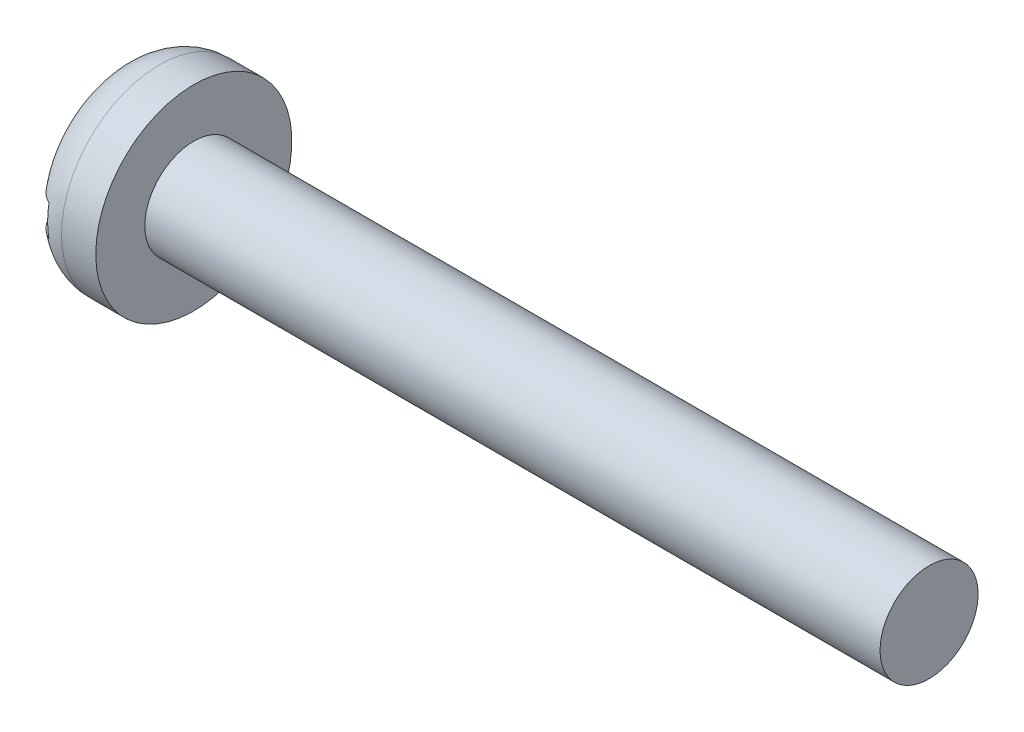
ISO-10303-21;
HEADER;
FILE_DESCRIPTION(('STEP AP214'),'2;1');
FILE_NAME('part.step','',(''),(''),'','','');
FILE_SCHEMA(('AUTOMOTIVE_DESIGN { 1 0 10303 214 1 1 1 1 }'));
ENDSEC;
DATA;
#1=APPLICATION_CONTEXT('core data for automotive mechanical design processes');
#2=APPLICATION_PROTOCOL_DEFINITION('international standard','automotive_design',2000,#1);
#3=PRODUCT_CONTEXT('',#1,'mechanical');
#4=PRODUCT('Part','Part','',(#3));
#5=PRODUCT_RELATED_PRODUCT_CATEGORY('part','',(#4));
#6=PRODUCT_DEFINITION_FORMATION('','',#4);
#7=PRODUCT_DEFINITION_CONTEXT('part definition',#1,'design');
#8=PRODUCT_DEFINITION('design','',#6,#7);
#9=PRODUCT_DEFINITION_SHAPE('','',#8);
#10=(LENGTH_UNIT() NAMED_UNIT(*) SI_UNIT(.MILLI.,.METRE.));
#11=(NAMED_UNIT(*) PLANE_ANGLE_UNIT() SI_UNIT($,.RADIAN.));
#12=(NAMED_UNIT(*) SI_UNIT($,.STERADIAN.) SOLID_ANGLE_UNIT());
#13=UNCERTAINTY_MEASURE_WITH_UNIT(LENGTH_MEASURE(1.E-05),#10,'distance_accuracy_value','');
#14=(GEOMETRIC_REPRESENTATION_CONTEXT(3) GLOBAL_UNCERTAINTY_ASSIGNED_CONTEXT((#13)) GLOBAL_UNIT_ASSIGNED_CONTEXT((#10,
#11,#12)) REPRESENTATION_CONTEXT('',''));
#15=CARTESIAN_POINT('',(0.,0.,0.));
#16=DIRECTION('',(0.,0.,1.));
#17=DIRECTION('',(1.,0.,0.));
#18=AXIS2_PLACEMENT_3D('',#15,#16,#17);
#19=CARTESIAN_POINT('',(0.,0.,0.));
#20=DIRECTION('',(-1.,0.,0.));
#21=DIRECTION('',(0.,0.,1.));
#22=AXIS2_PLACEMENT_3D('',#19,#20,#21);
#23=PLANE('',#22);
#24=DIRECTION('',(0.,0.,-1.));
#25=VECTOR('',#24,1.);
#26=CARTESIAN_POINT('',(0.,0.949999999999999,6.));
#27=LINE('',#26,#25);
#28=CARTESIAN_POINT('',(0.,0.949999999999999,3.36860505254029));
#29=VERTEX_POINT('',#28);
#30=CARTESIAN_POINT('',(0.,0.949999999999999,-3.36860505254029));
#31=VERTEX_POINT('',#30);
#32=EDGE_CURVE('E87',#29,#31,#27,.T.);
#33=ORIENTED_EDGE('',*,*,#32,.F.);
#34=CARTESIAN_POINT('',(0.,0.,0.));
#35=DIRECTION('',(-1.,0.,0.));
#36=DIRECTION('',(0.,0.,1.));
#37=AXIS2_PLACEMENT_3D('',#34,#35,#36);
#38=CIRCLE('',#37,3.5);
#39=EDGE_CURVE('E94',#29,#31,#38,.T.);
#40=ORIENTED_EDGE('',*,*,#39,.T.);
#41=EDGE_LOOP('',(#33,#40));
#42=FACE_BOUND('',#41,.T.);
#43=ADVANCED_FACE('F33',(#42),#23,.T.);
#44=CARTESIAN_POINT('',(-25.4,0.,0.));
#45=DIRECTION('',(-1.,0.,0.));
#46=DIRECTION('',(0.,0.,1.));
#47=AXIS2_PLACEMENT_3D('',#44,#45,#46);
#48=CYLINDRICAL_SURFACE('',#47,3.);
#49=CARTESIAN_POINT('',(49.6,0.,0.));
#50=DIRECTION('',(-1.,0.,0.));
#51=DIRECTION('',(0.,0.,1.));
#52=AXIS2_PLACEMENT_3D('',#49,#50,#51);
#53=CIRCLE('',#52,3.);
#54=CARTESIAN_POINT('',(49.6,0.,3.));
#55=VERTEX_POINT('',#54);
#56=EDGE_CURVE('E98',#55,#55,#53,.T.);
#57=ORIENTED_EDGE('',*,*,#56,.T.);
#58=EDGE_LOOP('',(#57));
#59=FACE_BOUND('',#58,.T.);
#60=CARTESIAN_POINT('',(4.6,0.,0.));
#61=DIRECTION('',(-1.,0.,0.));
#62=DIRECTION('',(0.,0.,1.));
#63=AXIS2_PLACEMENT_3D('',#60,#61,#62);
#64=CIRCLE('',#63,3.);
#65=CARTESIAN_POINT('',(4.6,0.,3.));
#66=VERTEX_POINT('',#65);
#67=EDGE_CURVE('E164',#66,#66,#64,.T.);
#68=ORIENTED_EDGE('',*,*,#67,.F.);
#69=EDGE_LOOP('',(#68));
#70=FACE_BOUND('',#69,.T.);
#71=ADVANCED_FACE('F35',(#59,#70),#48,.T.);
#72=CARTESIAN_POINT('',(49.6,3.,0.));
#73=DIRECTION('',(1.,0.,0.));
#74=DIRECTION('',(0.,0.,-1.));
#75=AXIS2_PLACEMENT_3D('',#72,#73,#74);
#76=PLANE('',#75);
#77=ORIENTED_EDGE('',*,*,#56,.F.);
#78=EDGE_LOOP('',(#77));
#79=FACE_BOUND('',#78,.T.);
#80=ADVANCED_FACE('F150',(#79),#76,.T.);
#81=DIRECTION('',(0.,0.,1.));
#82=VECTOR('',#81,1.);
#83=CARTESIAN_POINT('',(0.,-0.949999999999999,-6.));
#84=LINE('',#83,#82);
#85=CARTESIAN_POINT('',(0.,-0.95,-3.36860505254029));
#86=VERTEX_POINT('',#85);
#87=CARTESIAN_POINT('',(0.,-0.95,3.36860505254029));
#88=VERTEX_POINT('',#87);
#89=EDGE_CURVE('E78',#86,#88,#84,.T.);
#90=ORIENTED_EDGE('',*,*,#89,.F.);
#91=EDGE_CURVE('E85',#86,#88,#38,.T.);
#92=ORIENTED_EDGE('',*,*,#91,.T.);
#93=EDGE_LOOP('',(#90,#92));
#94=FACE_BOUND('',#93,.T.);
#95=ADVANCED_FACE('F84',(#94),#23,.T.);
#96=CARTESIAN_POINT('',(2.5,0.,0.));
#97=DIRECTION('',(-1.,0.,0.));
#98=DIRECTION('',(0.,0.,1.));
#99=AXIS2_PLACEMENT_3D('',#96,#97,#98);
#100=TOROIDAL_SURFACE('',#99,3.5,2.5);
#101=CARTESIAN_POINT('',(0.985757487586043,0.949999999999999,-5.40640719593364));
#102=CARTESIAN_POINT('',(1.0960246543744,0.949999999999999,-5.49163070649515));
#103=CARTESIAN_POINT('',(1.21345725337497,0.949999999999999,-5.56759101461142));
#104=CARTESIAN_POINT('',(1.45940951691372,0.949999999999999,-5.69875280035604));
#105=CARTESIAN_POINT('',(1.58792998718042,0.949999999999999,-5.75395276781641));
#106=CARTESIAN_POINT('',(1.85245352426851,0.949999999999999,-5.84195627301216));
#107=CARTESIAN_POINT('',(1.98845801136125,0.949999999999999,-5.87475554373));
#108=CARTESIAN_POINT('',(2.2640484787982,0.949999999999999,-5.91696137889887));
#109=CARTESIAN_POINT('',(2.40363438233771,0.949999999999999,-5.92636844458086));
#110=CARTESIAN_POINT('',(2.68189254927929,0.949999999999999,-5.9215193074279));
#111=CARTESIAN_POINT('',(2.82056629456852,0.949999999999999,-5.90734768635466));
#112=CARTESIAN_POINT('',(3.09356313269792,0.949999999999999,-5.8559230711435));
#113=CARTESIAN_POINT('',(3.22788626815686,0.949999999999999,-5.81867030318148));
#114=CARTESIAN_POINT('',(3.48839639796421,0.949999999999999,-5.72218287655927));
#115=CARTESIAN_POINT('',(3.61458288554869,0.949999999999999,-5.66294685029441));
#116=CARTESIAN_POINT('',(3.85528821850123,0.949999999999999,-5.52423756566409));
#117=CARTESIAN_POINT('',(3.96980694061318,0.949999999999999,-5.44476409354505));
#118=CARTESIAN_POINT('',(4.18461644915339,0.949999999999999,-5.26742418428832));
#119=CARTESIAN_POINT('',(4.28482794528762,0.949999999999999,-5.16946174096437));
#120=CARTESIAN_POINT('',(4.46761018892142,0.949999999999999,-4.95827853166357));
#121=CARTESIAN_POINT('',(4.55018021621203,0.949999999999999,-4.84505714305136));
#122=CARTESIAN_POINT('',(4.6964618145522,0.949999999999999,-4.60515862691978));
#123=CARTESIAN_POINT('',(4.75993502075184,0.949999999999999,-4.47833624513149));
#124=CARTESIAN_POINT('',(4.86519128396717,0.949999999999999,-4.216006675685));
#125=CARTESIAN_POINT('',(4.90697326851459,0.949999999999999,-4.08049905897912));
#126=CARTESIAN_POINT('',(4.96877288979412,0.949999999999999,-3.80148030851792));
#127=CARTESIAN_POINT('',(4.98828994076889,0.949999999999999,-3.65785854983236));
#128=CARTESIAN_POINT('',(5.00388905060571,0.949999999999999,-3.36936472192663));
#129=CARTESIAN_POINT('',(4.99996712568182,0.949999999999999,-3.22449244434158));
#130=CARTESIAN_POINT('',(4.96886168646542,0.949999999999999,-2.93149923465041));
#131=CARTESIAN_POINT('',(4.94076545847795,0.949999999999999,-2.78347601769688));
#132=CARTESIAN_POINT('',(4.86179251029822,0.949999999999999,-2.49370498974781));
#133=CARTESIAN_POINT('',(4.81091477709945,0.949999999999999,-2.35195745811604));
#134=CARTESIAN_POINT('',(4.68432590278113,0.949999999999999,-2.0676710169359));
#135=CARTESIAN_POINT('',(4.6070836733444,0.949999999999999,-1.92581763566409));
#136=CARTESIAN_POINT('',(4.43260457252834,0.949999999999999,-1.65498675561918));
#137=CARTESIAN_POINT('',(4.33535555151598,0.949999999999999,-1.52601715188148));
#138=CARTESIAN_POINT('',(4.15558158713623,0.949999999999999,-1.31792058640318));
#139=CARTESIAN_POINT('',(4.07707768568563,0.949999999999999,-1.23525340834472));
#140=CARTESIAN_POINT('',(3.91316302734682,0.949999999999999,-1.07694207191158));
#141=CARTESIAN_POINT('',(3.82774634491805,0.949999999999999,-1.00130406072668));
#142=CARTESIAN_POINT('',(3.65082716898194,0.949999999999999,-0.856838393555277));
#143=CARTESIAN_POINT('',(3.55930398834713,0.949999999999999,-0.788036080873473));
#144=CARTESIAN_POINT('',(3.41818824977931,0.949999999999999,-0.690527581558325));
#145=CARTESIAN_POINT('',(3.37053288173668,0.949999999999999,-0.658986477460066));
#146=CARTESIAN_POINT('',(3.27389562073701,0.949999999999999,-0.59798347673208));
#147=CARTESIAN_POINT('',(3.22491367628625,0.949999999999999,-0.568521660974607));
#148=CARTESIAN_POINT('',(3.13849640520252,0.949999999999999,-0.519492709774468));
#149=CARTESIAN_POINT('',(3.10138729295707,0.949999999999999,-0.499351276456494));
#150=CARTESIAN_POINT('',(3.02628744848822,0.949999999999999,-0.460801954672154));
#151=CARTESIAN_POINT('',(2.98829701842005,0.949999999999999,-0.442393482704893));
#152=CARTESIAN_POINT('',(2.91146884370101,0.949999999999999,-0.407994032029873));
#153=CARTESIAN_POINT('',(2.87263693099374,0.949999999999999,-0.391990274596523));
#154=CARTESIAN_POINT('',(2.79379248729238,0.949999999999999,-0.363282902997544));
#155=CARTESIAN_POINT('',(2.75378115300952,0.949999999999999,-0.350576063790533));
#156=CARTESIAN_POINT('',(2.66320433379855,0.949999999999999,-0.327619337416319));
#157=CARTESIAN_POINT('',(2.6123027238039,0.949999999999999,-0.31857970209921));
#158=CARTESIAN_POINT('',(2.50986433438601,0.949999999999999,-0.310684043152031));
#159=CARTESIAN_POINT('',(2.45833155237097,0.949999999999999,-0.311781379453138));
#160=CARTESIAN_POINT('',(2.3441971018951,0.949999999999999,-0.325047201146202));
#161=CARTESIAN_POINT('',(2.28193294571478,0.949999999999999,-0.339829284875283));
#162=CARTESIAN_POINT('',(2.15986294887481,0.949999999999999,-0.378504788709212));
#163=CARTESIAN_POINT('',(2.10009265618593,0.949999999999999,-0.402498866907792));
#164=CARTESIAN_POINT('',(1.99657724093186,0.949999999999999,-0.4494526691371));
#165=CARTESIAN_POINT('',(1.95233735610731,0.949999999999999,-0.471355737155981));
#166=CARTESIAN_POINT('',(1.86502792568779,0.949999999999999,-0.517396006662742));
#167=CARTESIAN_POINT('',(1.82195874340372,0.949999999999999,-0.541533891681891));
#168=CARTESIAN_POINT('',(1.69416134372497,0.949999999999999,-0.616622365055636));
#169=CARTESIAN_POINT('',(1.61096648017226,0.949999999999999,-0.670188293943025));
#170=CARTESIAN_POINT('',(1.44850480676655,0.949999999999999,-0.782846033467981));
#171=CARTESIAN_POINT('',(1.36923597811114,0.949999999999999,-0.841934958036584));
#172=CARTESIAN_POINT('',(1.2150372523291,0.949999999999999,-0.965398205172246));
#173=CARTESIAN_POINT('',(1.14010325850892,0.949999999999999,-1.02976739366112));
#174=CARTESIAN_POINT('',(0.991345431773045,0.949999999999999,-1.16734920985624));
#175=CARTESIAN_POINT('',(0.917785537703037,0.949999999999999,-1.24084849509693));
#176=CARTESIAN_POINT('',(0.777007097173586,0.949999999999999,-1.393757482978));
#177=CARTESIAN_POINT('',(0.709790805115148,0.949999999999999,-1.47316926901228));
#178=CARTESIAN_POINT('',(0.582949645102819,0.949999999999999,-1.63742646225696));
#179=CARTESIAN_POINT('',(0.523298982049618,0.949999999999999,-1.72225183818628));
#180=CARTESIAN_POINT('',(0.412341212465785,0.949999999999999,-1.89714173619478));
#181=CARTESIAN_POINT('',(0.361031049489153,0.949999999999999,-1.98720432255247));
#182=CARTESIAN_POINT('',(0.241333181812715,0.949999999999999,-2.22423494737613));
#183=CARTESIAN_POINT('',(0.179619284949908,0.949999999999999,-2.37466664836426));
#184=CARTESIAN_POINT('',(0.0820821224887529,0.949999999999999,-2.68386866128484));
#185=CARTESIAN_POINT('',(0.0462790228054453,0.949999999999999,-2.84264536512711));
#186=CARTESIAN_POINT('',(0.00288044941699427,0.949999999999999,-3.16463346968367));
#187=CARTESIAN_POINT('',(-0.00461915343281702,0.949999999999999,-3.32785805992606));
#188=CARTESIAN_POINT('',(0.010132779717955,0.949999999999999,-3.65294101216191));
#189=CARTESIAN_POINT('',(0.0323692177076768,0.949999999999999,-3.81480002552674));
#190=CARTESIAN_POINT('',(0.103902095858439,0.949999999999999,-4.12032596650456));
#191=CARTESIAN_POINT('',(0.15117023674867,0.949999999999999,-4.26446939807142));
#192=CARTESIAN_POINT('',(0.270320003052728,0.949999999999999,-4.54219374189562));
#193=CARTESIAN_POINT('',(0.342192867118273,0.949999999999999,-4.67577839315281));
#194=CARTESIAN_POINT('',(0.501366568017438,0.949999999999999,-4.91710962163136));
#195=CARTESIAN_POINT('',(0.586802244455219,0.949999999999999,-5.02609097119146));
#196=CARTESIAN_POINT('',(0.774404557623305,0.949999999999999,-5.22854298028413));
#197=CARTESIAN_POINT('',(0.876567994157818,0.949999999999999,-5.32201659973516));
#198=CARTESIAN_POINT('',(0.985757487586043,0.949999999999999,-5.40640719593364));
#199=B_SPLINE_CURVE_WITH_KNOTS('',3,(#101,#102,#103,#104,#105,#106,#107,#108,#109,#110,#111,
#112,#113,#114,#115,#116,#117,#118,#119,#120,#121,#122,#123,#124,#125,#126,#127,#128,#129,#130,
#131,#132,#133,#134,#135,#136,#137,#138,#139,#140,#141,#142,#143,#144,#145,#146,#147,#148,#149,
#150,#151,#152,#153,#154,#155,#156,#157,#158,#159,#160,#161,#162,#163,#164,#165,#166,#167,#168,
#169,#170,#171,#172,#173,#174,#175,#176,#177,#178,#179,#180,#181,#182,#183,#184,#185,#186,#187,
#188,#189,#190,#191,#192,#193,#194,#195,#196,#197,#198),.UNSPECIFIED.,.T.,.F.,(4,2,2,2,2,2,2,2,
2,2,2,2,2,2,2,2,2,2,2,2,2,2,2,2,2,2,2,2,2,2,2,2,2,2,2,2,2,2,2,2,2,2,2,2,2,2,2,2,4),(0.,
0.417602205111678,0.835234781957883,1.25294688976223,1.67065004706161,2.08685804258129,
2.50306195967548,2.91929177365212,3.33552598414697,3.75398416617563,4.17245942840176,
4.59595987338934,5.01948125530449,5.45234787455651,5.88528806771349,6.33532940035349,
6.78539074659976,7.26803237171639,7.75096796302287,8.09255819507888,8.43444439957287,
8.77755422306675,8.94895908076607,9.12037060145019,9.24700484031599,9.37359628683905,
9.4994892300642,9.62525855668316,9.77954315070494,9.93311823823632,10.1238387490496,
10.3167054395285,10.4647284627095,10.6127969100706,10.9093428566018,11.2057346987934,
11.5018416952027,11.8134652152721,12.1251990669184,12.4358397261151,12.746366290549,
13.2319078793747,13.7178269514274,14.2053904803925,14.692706550549,15.1455047075273,
15.5981417977465,16.0117416877723,16.4252625440592),.UNSPECIFIED.);
#200=CARTESIAN_POINT('',(1.4,0.949999999999999,-5.66590337231854));
#201=VERTEX_POINT('',#200);
#202=EDGE_CURVE('E11',#31,#201,#199,.T.);
#203=ORIENTED_EDGE('',*,*,#202,.F.);
#204=ORIENTED_EDGE('',*,*,#39,.F.);
#205=CARTESIAN_POINT('',(1.52358531353306,0.949999999999999,0.730788734090353));
#206=CARTESIAN_POINT('',(1.57414447711104,0.949999999999999,0.695611865282628));
#207=CARTESIAN_POINT('',(1.6254543888315,0.949999999999999,0.66152472818807));
#208=CARTESIAN_POINT('',(1.72963539003654,0.949999999999999,0.595749305574147));
#209=CARTESIAN_POINT('',(1.78250725994791,0.949999999999999,0.564062248419082));
#210=CARTESIAN_POINT('',(1.88987218981569,0.949999999999999,0.503705647099686));
#211=CARTESIAN_POINT('',(1.94436296912417,0.949999999999999,0.475032094219786));
#212=CARTESIAN_POINT('',(2.05532998444995,0.949999999999999,0.421935373591928));
#213=CARTESIAN_POINT('',(2.11180368478585,0.949999999999999,0.397506999303839));
#214=CARTESIAN_POINT('',(2.22514363813367,0.949999999999999,0.35653735960577));
#215=CARTESIAN_POINT('',(2.28189862196265,0.949999999999999,0.339713503308112));
#216=CARTESIAN_POINT('',(2.368382300921,0.949999999999999,0.322715197787573));
#217=CARTESIAN_POINT('',(2.39728378133585,0.949999999999999,0.318423319527596));
#218=CARTESIAN_POINT('',(2.45538244656012,0.949999999999999,0.312995317515041));
#219=CARTESIAN_POINT('',(2.48457950731392,0.949999999999999,0.31185792078449));
#220=CARTESIAN_POINT('',(2.5430530209603,0.949999999999999,0.312886363159002));
#221=CARTESIAN_POINT('',(2.57232918661821,0.949999999999999,0.315068011461225));
#222=CARTESIAN_POINT('',(2.63050049355532,0.949999999999999,0.322489566316225));
#223=CARTESIAN_POINT('',(2.65939527714065,0.949999999999999,0.327732160476231));
#224=CARTESIAN_POINT('',(2.74584198700224,0.949999999999999,0.347360599943046));
#225=CARTESIAN_POINT('',(2.80250165922958,0.949999999999999,0.365615056957745));
#226=CARTESIAN_POINT('',(2.89573148092915,0.949999999999999,0.401378314917992));
#227=CARTESIAN_POINT('',(2.93297421504802,0.949999999999999,0.417287667067852));
#228=CARTESIAN_POINT('',(3.00653749579833,0.949999999999999,0.451146337182023));
#229=CARTESIAN_POINT('',(3.04285783404559,0.949999999999999,0.469096111182381));
#230=CARTESIAN_POINT('',(3.15074353509149,0.949999999999999,0.525282248710041));
#231=CARTESIAN_POINT('',(3.22111053295533,0.949999999999999,0.565804022999056));
#232=CARTESIAN_POINT('',(3.35925564579439,0.949999999999999,0.651162367222228));
#233=CARTESIAN_POINT('',(3.42703045774533,0.949999999999999,0.696004201726546));
#234=CARTESIAN_POINT('',(3.55986403278011,0.949999999999999,0.789400291946055));
#235=CARTESIAN_POINT('',(3.62492559545416,0.949999999999999,0.837950566950053));
#236=CARTESIAN_POINT('',(3.75874947130769,0.949999999999999,0.943841092644289));
#237=CARTESIAN_POINT('',(3.82720430417487,0.949999999999999,1.00157183722886));
#238=CARTESIAN_POINT('',(3.96018939418112,0.949999999999999,1.12140985444229));
#239=CARTESIAN_POINT('',(4.02471832508631,0.949999999999999,1.18351859090113));
#240=CARTESIAN_POINT('',(4.21106791050451,0.949999999999999,1.37595644776908));
#241=CARTESIAN_POINT('',(4.32627867862902,0.949999999999999,1.51288578357786));
#242=CARTESIAN_POINT('',(4.52945706270996,0.949999999999999,1.79729098426636));
#243=CARTESIAN_POINT('',(4.61834920932038,0.949999999999999,1.94410275602601));
#244=CARTESIAN_POINT('',(4.7707723715716,0.949999999999999,2.25075357422791));
#245=CARTESIAN_POINT('',(4.83426867102256,0.949999999999999,2.41061009612709));
#246=CARTESIAN_POINT('',(4.93220654124611,0.949999999999999,2.7399108052941));
#247=CARTESIAN_POINT('',(4.96650927127559,0.949999999999999,2.90939676339063));
#248=CARTESIAN_POINT('',(5.00286787316264,0.949999999999999,3.25175998697038));
#249=CARTESIAN_POINT('',(5.00495003211649,0.949999999999999,3.42463437269224));
#250=CARTESIAN_POINT('',(4.97713840335531,0.949999999999999,3.75121956698943));
#251=CARTESIAN_POINT('',(4.9502638922016,0.949999999999999,3.90519057105068));
#252=CARTESIAN_POINT('',(4.86942868287624,0.949999999999999,4.20587080654959));
#253=CARTESIAN_POINT('',(4.81547534623549,0.949999999999999,4.35258199970551));
#254=CARTESIAN_POINT('',(4.68571236663448,0.949999999999999,4.62558995092548));
#255=CARTESIAN_POINT('',(4.61135223250931,0.949999999999999,4.75257725130448));
#256=CARTESIAN_POINT('',(4.44176565814093,0.949999999999999,4.9917527620997));
#257=CARTESIAN_POINT('',(4.34654402622863,0.949999999999999,5.10394437321895));
#258=CARTESIAN_POINT('',(4.14102511945679,0.949999999999999,5.30695885867243));
#259=CARTESIAN_POINT('',(4.03124930108697,0.949999999999999,5.39831008266655));
#260=CARTESIAN_POINT('',(3.79771784192173,0.949999999999999,5.56094338849552));
#261=CARTESIAN_POINT('',(3.67396338206449,0.949999999999999,5.63222716388657));
#262=CARTESIAN_POINT('',(3.41805446048242,0.949999999999999,5.7516104541234));
#263=CARTESIAN_POINT('',(3.28605801917692,0.949999999999999,5.80004891542578));
#264=CARTESIAN_POINT('',(3.01577323526032,0.949999999999999,5.87389344099697));
#265=CARTESIAN_POINT('',(2.87748521726569,0.949999999999999,5.89930069215839));
#266=CARTESIAN_POINT('',(2.59963234199955,0.949999999999999,5.92621979869901));
#267=CARTESIAN_POINT('',(2.46008433231466,0.949999999999999,5.92790585690305));
#268=CARTESIAN_POINT('',(2.18269472016475,0.949999999999999,5.90778234089324));
#269=CARTESIAN_POINT('',(2.04485308568435,0.949999999999999,5.88597320817919));
#270=CARTESIAN_POINT('',(1.77502149803397,0.949999999999999,5.81956358162439));
#271=CARTESIAN_POINT('',(1.64302217254237,0.949999999999999,5.77500114419764));
#272=CARTESIAN_POINT('',(1.38834292815749,0.949999999999999,5.66442177087539));
#273=CARTESIAN_POINT('',(1.26566306018986,0.949999999999999,5.59840471775277));
#274=CARTESIAN_POINT('',(1.03261842959217,0.949999999999999,5.44658627040026));
#275=CARTESIAN_POINT('',(0.922298147981992,0.949999999999999,5.36071662257254));
#276=CARTESIAN_POINT('',(0.717477474444276,0.949999999999999,5.17183395564912));
#277=CARTESIAN_POINT('',(0.622977416560928,0.949999999999999,5.06882057465487));
#278=CARTESIAN_POINT('',(0.451465302503932,0.949999999999999,4.84757094725425));
#279=CARTESIAN_POINT('',(0.374627780616016,0.949999999999999,4.72919947027024));
#280=CARTESIAN_POINT('',(0.24151969117909,0.949999999999999,4.48141766671495));
#281=CARTESIAN_POINT('',(0.185250746666786,0.949999999999999,4.35200647000867));
#282=CARTESIAN_POINT('',(0.0936872313540881,0.949999999999999,4.08334793126013));
#283=CARTESIAN_POINT('',(0.0587919572312948,0.949999999999999,3.94396467727759));
#284=CARTESIAN_POINT('',(0.0121226147980619,0.949999999999999,3.66141175709353));
#285=CARTESIAN_POINT('',(0.000348905846883737,0.949999999999999,3.51824203207708));
#286=CARTESIAN_POINT('',(-0.000344527773976215,0.949999999999999,3.22723540129801));
#287=CARTESIAN_POINT('',(0.0114869159787331,0.949999999999999,3.07939724933402));
#288=CARTESIAN_POINT('',(0.0584160658443571,0.949999999999999,2.78745930029254));
#289=CARTESIAN_POINT('',(0.0935231867912864,0.949999999999999,2.64336104049237));
#290=CARTESIAN_POINT('',(0.187868783915479,0.949999999999999,2.3539050825597));
#291=CARTESIAN_POINT('',(0.248407486517856,0.949999999999999,2.20897364808074));
#292=CARTESIAN_POINT('',(0.39059444011966,0.949999999999999,1.9300102797438));
#293=CARTESIAN_POINT('',(0.472235382468667,0.949999999999999,1.79597459328602));
#294=CARTESIAN_POINT('',(0.627593613304986,0.949999999999999,1.57676864247503));
#295=CARTESIAN_POINT('',(0.697021500424618,0.949999999999999,1.48849949282114));
#296=CARTESIAN_POINT('',(0.843775250179483,0.949999999999999,1.31870511792918));
#297=CARTESIAN_POINT('',(0.921105785195406,0.949999999999999,1.23718393452889));
#298=CARTESIAN_POINT('',(1.08271735077251,0.949999999999999,1.08075073034173));
#299=CARTESIAN_POINT('',(1.16702383463504,0.949999999999999,1.00586518122711));
#300=CARTESIAN_POINT('',(1.34124791062673,0.949999999999999,0.86303814828315));
#301=CARTESIAN_POINT('',(1.43116224313387,0.949999999999999,0.795092689934572));
#302=CARTESIAN_POINT('',(1.52358531353306,0.949999999999999,0.730788734090353));
#303=B_SPLINE_CURVE_WITH_KNOTS('',3,(#205,#206,#207,#208,#209,#210,#211,#212,#213,#214,#215,
#216,#217,#218,#219,#220,#221,#222,#223,#224,#225,#226,#227,#228,#229,#230,#231,#232,#233,#234,
#235,#236,#237,#238,#239,#240,#241,#242,#243,#244,#245,#246,#247,#248,#249,#250,#251,#252,#253,
#254,#255,#256,#257,#258,#259,#260,#261,#262,#263,#264,#265,#266,#267,#268,#269,#270,#271,#272,
#273,#274,#275,#276,#277,#278,#279,#280,#281,#282,#283,#284,#285,#286,#287,#288,#289,#290,#291,
#292,#293,#294,#295,#296,#297,#298,#299,#300,#301,#302),.UNSPECIFIED.,.T.,.F.,(4,2,2,2,2,2,2,2,
2,2,2,2,2,2,2,2,2,2,2,2,2,2,2,2,2,2,2,2,2,2,2,2,2,2,2,2,2,2,2,2,2,2,2,2,2,2,2,2,4),(0.,
0.184750482786314,0.369594891020427,0.554190211782583,0.738557511032416,0.915356865460106,
1.0028634970404,1.09033481053965,1.17822407175055,1.2661906188094,1.4440581516214,
1.5655178685025,1.68700478530818,1.93037710488979,2.17404985083863,2.41746461340615,
2.6859113993479,2.9544483731441,3.48915624493477,4.0019040983964,4.51535050329786,
5.03122535872049,5.54667931633915,6.01315938448346,6.47951270603436,6.91881182826794,
7.35800980352386,7.78438196473771,8.21071813224632,8.63051279869512,9.0502858301748,
9.46697452516122,9.88365539025752,10.2996416007892,10.7156300842902,11.1330705902298,
11.5505199093186,11.9719321747958,12.393377686131,12.8224738166109,13.2515766161224,
13.6945521799441,14.1377070334127,14.6069788584153,15.0760883708493,15.4125225816876,
15.749156870342,16.0870787348563,16.424805976932),.UNSPECIFIED.);
#304=CARTESIAN_POINT('',(1.4,0.949999999999999,5.66590337231854));
#305=VERTEX_POINT('',#304);
#306=EDGE_CURVE('E113',#305,#29,#303,.T.);
#307=ORIENTED_EDGE('',*,*,#306,.F.);
#308=CARTESIAN_POINT('',(1.4,0.,0.));
#309=DIRECTION('',(-1.,0.,0.));
#310=DIRECTION('',(0.,0.,1.));
#311=AXIS2_PLACEMENT_3D('',#308,#309,#310);
#312=CIRCLE('',#311,5.74499443206436);
#313=CARTESIAN_POINT('',(1.4,-0.950000000000001,5.66590337231854));
#314=VERTEX_POINT('',#313);
#315=EDGE_CURVE('E106',#305,#314,#312,.F.);
#316=ORIENTED_EDGE('',*,*,#315,.T.);
#317=CARTESIAN_POINT('',(1.52358531353306,-0.95,0.730788734090353));
#318=CARTESIAN_POINT('',(1.42849505237443,-0.95,0.796947461363682));
#319=CARTESIAN_POINT('',(1.33605707497728,-0.95,0.866961424058596));
#320=CARTESIAN_POINT('',(1.15714284091226,-0.95,1.01432517852776));
#321=CARTESIAN_POINT('',(1.07066994955133,-0.95,1.09167905372337));
#322=CARTESIAN_POINT('',(0.905079327352198,-0.95,1.25356198972644));
#323=CARTESIAN_POINT('',(0.825944246950176,-0.95,1.33807317207079));
#324=CARTESIAN_POINT('',(0.67618429083633,-0.95,1.51424242507324));
#325=CARTESIAN_POINT('',(0.605554462302031,-0.95,1.60589628464482));
#326=CARTESIAN_POINT('',(0.443858760320497,-0.95,1.83988636563798));
#327=CARTESIAN_POINT('',(0.358336728186036,-0.95,1.98614315853907));
#328=CARTESIAN_POINT('',(0.212481034918788,-0.95,2.29083141738826));
#329=CARTESIAN_POINT('',(0.152151427346854,-0.95,2.44926483775162));
#330=CARTESIAN_POINT('',(0.0599446919384644,-0.95,2.77514190209646));
#331=CARTESIAN_POINT('',(0.0282069271220361,-0.95,2.94262550588637));
#332=CARTESIAN_POINT('',(-0.00382337045479464,-0.95,3.28059833994368));
#333=CARTESIAN_POINT('',(-0.00412879953232205,-0.95,3.4510863088392));
#334=CARTESIAN_POINT('',(0.0263775213432045,-0.95,3.77464976210912));
#335=CARTESIAN_POINT('',(0.0545525691913745,-0.950000000000001,3.92797577950032));
#336=CARTESIAN_POINT('',(0.13780681374328,-0.950000000000001,4.22714823212525));
#337=CARTESIAN_POINT('',(0.19287712423401,-0.950000000000001,4.37299712023268));
#338=CARTESIAN_POINT('',(0.324697977143317,-0.950000000000001,4.6443949327566));
#339=CARTESIAN_POINT('',(0.400049052542686,-0.950000000000001,4.77062504565425));
#340=CARTESIAN_POINT('',(0.571462922352241,-0.950000000000001,5.0081366256341));
#341=CARTESIAN_POINT('',(0.667521396680896,-0.950000000000001,5.11942120288138));
#342=CARTESIAN_POINT('',(0.874559333341279,-0.950000000000001,5.32057770434432));
#343=CARTESIAN_POINT('',(0.985030613949815,-0.950000000000001,5.41097311544615));
#344=CARTESIAN_POINT('',(1.21977614433261,-0.950000000000001,5.57159519120383));
#345=CARTESIAN_POINT('',(1.34404919343241,-0.950000000000001,5.6418236083692));
#346=CARTESIAN_POINT('',(1.60082882553333,-0.950000000000001,5.75906184590212));
#347=CARTESIAN_POINT('',(1.73318272517523,-0.950000000000001,5.80640629214026));
#348=CARTESIAN_POINT('',(2.00399154739436,-0.950000000000001,5.87802196171267));
#349=CARTESIAN_POINT('',(2.14244616477332,-0.950000000000001,5.90229433789636));
#350=CARTESIAN_POINT('',(2.42045856989074,-0.950000000000001,5.92694756317496));
#351=CARTESIAN_POINT('',(2.56000125766223,-0.950000000000001,5.92749901826561));
#352=CARTESIAN_POINT('',(2.83718991634231,-0.950000000000001,5.90512640762981));
#353=CARTESIAN_POINT('',(2.97483592187322,-0.950000000000001,5.88220277099825));
#354=CARTESIAN_POINT('',(3.24411049817071,-0.950000000000001,5.81361466290385));
#355=CARTESIAN_POINT('',(3.37574802511874,-0.950000000000001,5.76798533102343));
#356=CARTESIAN_POINT('',(3.62953175403254,-0.950000000000001,5.65535052310886));
#357=CARTESIAN_POINT('',(3.75167789800231,-0.950000000000001,5.58834491647023));
#358=CARTESIAN_POINT('',(3.9835135875334,-0.950000000000001,5.43464282918939));
#359=CARTESIAN_POINT('',(4.0931564471513,-0.950000000000001,5.34787595658511));
#360=CARTESIAN_POINT('',(4.29648540797115,-0.950000000000001,5.15732683009857));
#361=CARTESIAN_POINT('',(4.39017117287094,-0.950000000000001,5.05354421769323));
#362=CARTESIAN_POINT('',(4.55995028944159,-0.950000000000001,4.83087958749939));
#363=CARTESIAN_POINT('',(4.63586495710248,-0.950000000000001,4.71186139469701));
#364=CARTESIAN_POINT('',(4.76703923130308,-0.950000000000001,4.46294936398434));
#365=CARTESIAN_POINT('',(4.82229713281235,-0.950000000000001,4.33305462939589));
#366=CARTESIAN_POINT('',(4.91177631316116,-0.950000000000001,4.06355995625875));
#367=CARTESIAN_POINT('',(4.94559140360722,-0.95,3.92382533239847));
#368=CARTESIAN_POINT('',(4.99006805625275,-0.95,3.64075256035572));
#369=CARTESIAN_POINT('',(5.00072948781785,-0.95,3.49741439184644));
#370=CARTESIAN_POINT('',(4.99916789662835,-0.95,3.20618257618432));
#371=CARTESIAN_POINT('',(4.98618350385276,-0.95,3.0582935724438));
#372=CARTESIAN_POINT('',(4.93697375105037,-0.95,2.76642673089447));
#373=CARTESIAN_POINT('',(4.90073802780229,-0.95,2.62245066694107));
#374=CARTESIAN_POINT('',(4.80409096236218,-0.95,2.3332794278293));
#375=CARTESIAN_POINT('',(4.74236242457014,-0.95,2.18852708055074));
#376=CARTESIAN_POINT('',(4.59787754534201,-0.95,1.91009422075845));
#377=CARTESIAN_POINT('',(4.51513104864939,-0.95,1.77640856340737));
#378=CARTESIAN_POINT('',(4.36113274315841,-0.95,1.56229113789186));
#379=CARTESIAN_POINT('',(4.29456456073075,-0.95,1.47842131262722));
#380=CARTESIAN_POINT('',(4.15427683997197,-0.95,1.31682098790766));
#381=CARTESIAN_POINT('',(4.08055384279767,-0.95,1.23909349110341));
#382=CARTESIAN_POINT('',(3.92675957709209,-0.95,1.08964077174371));
#383=CARTESIAN_POINT('',(3.84666579502562,-0.95,1.01793886046301));
#384=CARTESIAN_POINT('',(3.68131423956416,-0.95,0.880848230876419));
#385=CARTESIAN_POINT('',(3.59605906828132,-0.95,0.815456373788784));
#386=CARTESIAN_POINT('',(3.45618685008394,-0.95,0.716218533319707));
#387=CARTESIAN_POINT('',(3.40304933804928,-0.95,0.680268952894276));
#388=CARTESIAN_POINT('',(3.29509269516208,-0.95,0.610906781773644));
#389=CARTESIAN_POINT('',(3.24027264503168,-0.95,0.577495613908765));
#390=CARTESIAN_POINT('',(3.12889801535382,-0.95,0.513827630076453));
#391=CARTESIAN_POINT('',(3.07234560549229,-0.95,0.483567061665226));
#392=CARTESIAN_POINT('',(2.95713658686762,-0.95,0.427477040167778));
#393=CARTESIAN_POINT('',(2.89848279471619,-0.95,0.401641905657537));
#394=CARTESIAN_POINT('',(2.78183402585761,-0.95,0.358722489842928));
#395=CARTESIAN_POINT('',(2.72401312226665,-0.95,0.341204006594348));
#396=CARTESIAN_POINT('',(2.63584024419484,-0.95,0.32340232172412));
#397=CARTESIAN_POINT('',(2.6063646030079,-0.95,0.318882989241304));
#398=CARTESIAN_POINT('',(2.5470952144922,-0.95,0.313119964405466));
#399=CARTESIAN_POINT('',(2.51730162723634,-0.95,0.311874695208438));
#400=CARTESIAN_POINT('',(2.45760150603011,-0.95,0.312826779223953));
#401=CARTESIAN_POINT('',(2.42769529754489,-0.95,0.315043815158633));
#402=CARTESIAN_POINT('',(2.36828072473083,-0.95,0.322666612923258));
#403=CARTESIAN_POINT('',(2.33877276530063,-0.95,0.32807540173616));
#404=CARTESIAN_POINT('',(2.25055785785886,-0.95,0.34833587817241));
#405=CARTESIAN_POINT('',(2.19279112866538,-0.95,0.367190830544));
#406=CARTESIAN_POINT('',(2.08165574400548,-0.95,0.410299532151126));
#407=CARTESIAN_POINT('',(2.02820525230526,-0.95,0.434358770396177));
#408=CARTESIAN_POINT('',(1.92305238870618,-0.95,0.486110152171816));
#409=CARTESIAN_POINT('',(1.87135152946205,-0.95,0.513805343108248));
#410=CARTESIAN_POINT('',(1.76950589636315,-0.95,0.571796801314838));
#411=CARTESIAN_POINT('',(1.71935983319957,-0.95,0.602090830462568));
#412=CARTESIAN_POINT('',(1.62044465340357,-0.95,0.664857195402249));
#413=CARTESIAN_POINT('',(1.57167579878768,-0.95,0.697329941784638));
#414=CARTESIAN_POINT('',(1.52358531353306,-0.95,0.730788734090353));
#415=B_SPLINE_CURVE_WITH_KNOTS('',3,(#317,#318,#319,#320,#321,#322,#323,#324,#325,#326,#327,
#328,#329,#330,#331,#332,#333,#334,#335,#336,#337,#338,#339,#340,#341,#342,#343,#344,#345,#346,
#347,#348,#349,#350,#351,#352,#353,#354,#355,#356,#357,#358,#359,#360,#361,#362,#363,#364,#365,
#366,#367,#368,#369,#370,#371,#372,#373,#374,#375,#376,#377,#378,#379,#380,#381,#382,#383,#384,
#385,#386,#387,#388,#389,#390,#391,#392,#393,#394,#395,#396,#397,#398,#399,#400,#401,#402,#403,
#404,#405,#406,#407,#408,#409,#410,#411,#412,#413,#414),.UNSPECIFIED.,.T.,.F.,(4,2,2,2,2,2,2,2,
2,2,2,2,2,2,2,2,2,2,2,2,2,2,2,2,2,2,2,2,2,2,2,2,2,2,2,2,2,2,2,2,2,2,2,2,2,2,2,2,4),(0.,
0.347472752875606,0.695139961865751,1.04196298435745,1.38858305626684,1.89464174865545,
2.40078183654461,2.90937582170321,3.41776113590796,3.88303272964139,4.34815070121794,
4.78701058362104,5.22577899732653,5.65193700465006,6.07805796767567,6.49774373987458,
6.91740854039922,7.33405451240116,7.75069286877936,8.16668842712022,8.5826865271542,
9.00019030348936,9.41770287779526,9.83924860107826,10.2608291114944,10.6901741298821,
11.1195215706547,11.5629386802819,12.0065535602906,12.4767206241384,12.9466678680685,
13.2675004813908,13.5884889744227,13.9106670168028,14.2326839644457,14.425093249497,
14.6176096000289,14.8098939706376,15.0019296034523,15.1823696566985,15.2716736790482,
15.3609346831919,15.4507049738204,15.5405605376054,15.7221357097338,15.8978334197687,
16.0736793390484,16.249375311356,16.4251044879819),.UNSPECIFIED.);
#416=EDGE_CURVE('E93',#88,#314,#415,.T.);
#417=ORIENTED_EDGE('',*,*,#416,.F.);
#418=ORIENTED_EDGE('',*,*,#91,.F.);
#419=CARTESIAN_POINT('',(0.985757487586042,-0.949999999999999,-5.40640719593364));
#420=CARTESIAN_POINT('',(0.873668767532725,-0.949999999999999,-5.31977031451533));
#421=CARTESIAN_POINT('',(0.768807686557899,-0.949999999999999,-5.22340500673066));
#422=CARTESIAN_POINT('',(0.57669264905925,-0.949999999999999,-5.0142000932875));
#423=CARTESIAN_POINT('',(0.489483873788254,-0.949999999999999,-4.90131945619146));
#424=CARTESIAN_POINT('',(0.335325298146494,-0.949999999999999,-4.66273949198548));
#425=CARTESIAN_POINT('',(0.268340800395836,-0.95,-4.53706261972271));
#426=CARTESIAN_POINT('',(0.156100960267286,-0.95,-4.27646699529002));
#427=CARTESIAN_POINT('',(0.110833591279423,-0.95,-4.14155340568653));
#428=CARTESIAN_POINT('',(0.0422755622145304,-0.95,-3.86393054765343));
#429=CARTESIAN_POINT('',(0.0193550795198133,-0.95,-3.72113006500129));
#430=CARTESIAN_POINT('',(-0.00310234366442392,-0.95,-3.4337095787643));
#431=CARTESIAN_POINT('',(-0.00263413150134954,-0.95,-3.28908918125843));
#432=CARTESIAN_POINT('',(0.021477064732243,-0.95,-2.99630792275096));
#433=CARTESIAN_POINT('',(0.0459954998453985,-0.95,-2.84821990795644));
#434=CARTESIAN_POINT('',(0.117943101685085,-0.95,-2.55776372517173));
#435=CARTESIAN_POINT('',(0.165376042190535,-0.95,-2.41539650352096));
#436=CARTESIAN_POINT('',(0.284895446620776,-0.95,-2.12980366424618));
#437=CARTESIAN_POINT('',(0.358460776773375,-0.95,-1.98720037191077));
#438=CARTESIAN_POINT('',(0.525835704953427,-0.95,-1.71446983058624));
#439=CARTESIAN_POINT('',(0.619650796391605,-0.95,-1.58434598091693));
#440=CARTESIAN_POINT('',(0.793531809868979,-0.95,-1.37442983971176));
#441=CARTESIAN_POINT('',(0.869452303524684,-0.95,-1.29113745056436));
#442=CARTESIAN_POINT('',(1.02830413457908,-0.95,-1.13142177135853));
#443=CARTESIAN_POINT('',(1.11124055024988,-0.95,-1.05500354095385));
#444=CARTESIAN_POINT('',(1.28327833215014,-0.95,-0.90882244326234));
#445=CARTESIAN_POINT('',(1.37240029438921,-0.95,-0.839083850495856));
#446=CARTESIAN_POINT('',(1.50990652775342,-0.95,-0.739895752557684));
#447=CARTESIAN_POINT('',(1.5563653966482,-0.95,-0.707744726487067));
#448=CARTESIAN_POINT('',(1.65055304366539,-0.95,-0.645364633268112));
#449=CARTESIAN_POINT('',(1.69828161382803,-0.95,-0.615135254096006));
#450=CARTESIAN_POINT('',(1.78651512860431,-0.95,-0.562024981243425));
#451=CARTESIAN_POINT('',(1.82680639027117,-0.95,-0.538789415082533));
#452=CARTESIAN_POINT('',(1.90837479426195,-0.95,-0.494133908172364));
#453=CARTESIAN_POINT('',(1.94965164957826,-0.95,-0.472713446928797));
#454=CARTESIAN_POINT('',(2.03322027825438,-0.95,-0.432340252637523));
#455=CARTESIAN_POINT('',(2.07550758816119,-0.95,-0.413378432931305));
#456=CARTESIAN_POINT('',(2.16144040139997,-0.95,-0.378897795306359));
#457=CARTESIAN_POINT('',(2.20508447839823,-0.95,-0.363375492370126));
#458=CARTESIAN_POINT('',(2.30022513886967,-0.95,-0.335708228652979));
#459=CARTESIAN_POINT('',(2.35196628181131,-0.95,-0.324339213224262));
#460=CARTESIAN_POINT('',(2.45646704144662,-0.95,-0.311819267677068));
#461=CARTESIAN_POINT('',(2.50921774572197,-0.95,-0.310601768746989));
#462=CARTESIAN_POINT('',(2.61362342830028,-0.95,-0.318714751156099));
#463=CARTESIAN_POINT('',(2.66528147019902,-0.95,-0.328010124399025));
#464=CARTESIAN_POINT('',(2.7669827718945,-0.95,-0.354068523988372));
#465=CARTESIAN_POINT('',(2.81700819285062,-0.95,-0.370895466900354));
#466=CARTESIAN_POINT('',(2.90502326003824,-0.95,-0.405213066166198));
#467=CARTESIAN_POINT('',(2.94336175213167,-0.95,-0.421846178274331));
#468=CARTESIAN_POINT('',(3.01906549609117,-0.95,-0.457213466939968));
#469=CARTESIAN_POINT('',(3.05643038096251,-0.95,-0.475948422049273));
#470=CARTESIAN_POINT('',(3.16741234677854,-0.95,-0.534567404825481));
#471=CARTESIAN_POINT('',(3.23978114152798,-0.95,-0.576807998679976));
#472=CARTESIAN_POINT('',(3.3818708054501,-0.95,-0.665840142109891));
#473=CARTESIAN_POINT('',(3.45158457448503,-0.95,-0.712642845458257));
#474=CARTESIAN_POINT('',(3.58809500654761,-0.95,-0.810172898021939));
#475=CARTESIAN_POINT('',(3.65489486668388,-0.95,-0.860895767525796));
#476=CARTESIAN_POINT('',(3.79119313053429,-0.95,-0.970856228610255));
#477=CARTESIAN_POINT('',(3.86040499590769,-0.95,-1.03044998627395));
#478=CARTESIAN_POINT('',(3.99466476021792,-0.95,-1.15421286998896));
#479=CARTESIAN_POINT('',(4.05971116672334,-0.95,-1.21838361870418));
#480=CARTESIAN_POINT('',(4.18474863157564,-0.95,-1.35102125598024));
#481=CARTESIAN_POINT('',(4.2447585443349,-0.95,-1.41947027854888));
#482=CARTESIAN_POINT('',(4.35932046326307,-0.95,-1.56075582523618));
#483=CARTESIAN_POINT('',(4.41387343792096,-0.95,-1.63359156711731));
#484=CARTESIAN_POINT('',(4.56148856732522,-0.95,-1.8484666772335));
#485=CARTESIAN_POINT('',(4.64701411438385,-0.95,-1.99584001786745));
#486=CARTESIAN_POINT('',(4.79257328122065,-0.95,-2.30298186264786));
#487=CARTESIAN_POINT('',(4.85257313155224,-0.95,-2.46276645812688));
#488=CARTESIAN_POINT('',(4.94362497149785,-0.95,-2.79127051287314));
#489=CARTESIAN_POINT('',(4.97454515888224,-0.95,-2.96002702519597));
#490=CARTESIAN_POINT('',(5.00446299076264,-0.95,-3.30031260797575));
#491=CARTESIAN_POINT('',(5.00348503771968,-0.95,-3.47183945868316));
#492=CARTESIAN_POINT('',(4.97025157623259,-0.95,-3.79593317573914));
#493=CARTESIAN_POINT('',(4.94086967562288,-0.95,-3.94879742045346));
#494=CARTESIAN_POINT('',(4.8553171402111,-0.95,-4.24685424229397));
#495=CARTESIAN_POINT('',(4.7991537633145,-0.95,-4.39204888608328));
#496=CARTESIAN_POINT('',(4.66532636328692,-0.95,-4.66207253977452));
#497=CARTESIAN_POINT('',(4.58904152293454,-0.949999999999999,-4.787586549605));
#498=CARTESIAN_POINT('',(4.41590777066837,-0.949999999999999,-5.02352119841263));
#499=CARTESIAN_POINT('',(4.31906334942166,-0.949999999999999,-5.13394512475431));
#500=CARTESIAN_POINT('',(4.11060155766926,-0.949999999999999,-5.33333615962294));
#501=CARTESIAN_POINT('',(3.99948039381216,-0.949999999999999,-5.42282248682496));
#502=CARTESIAN_POINT('',(3.76360079407308,-0.949999999999999,-5.58153532832667));
#503=CARTESIAN_POINT('',(3.6388433138667,-0.949999999999999,-5.650763261149));
#504=CARTESIAN_POINT('',(3.38124712969035,-0.949999999999999,-5.76597073858543));
#505=CARTESIAN_POINT('',(3.24855575903371,-0.949999999999999,-5.81227992329867));
#506=CARTESIAN_POINT('',(2.97726602641997,-0.949999999999999,-5.88178130842477));
#507=CARTESIAN_POINT('',(2.83866856989889,-0.949999999999999,-5.90497703905924));
#508=CARTESIAN_POINT('',(2.56056753526676,-0.949999999999999,-5.9274830104473));
#509=CARTESIAN_POINT('',(2.42107786340173,-0.949999999999999,-5.9269656200641));
#510=CARTESIAN_POINT('',(2.14409034230965,-0.949999999999999,-5.90247683208726));
#511=CARTESIAN_POINT('',(2.00659358348655,-0.949999999999999,-5.87849305274086));
#512=CARTESIAN_POINT('',(1.73767742277869,-0.949999999999999,-5.80780634059494));
#513=CARTESIAN_POINT('',(1.60625503057334,-0.949999999999999,-5.76111471982902));
#514=CARTESIAN_POINT('',(1.35330115642013,-0.949999999999999,-5.64645064767712));
#515=CARTESIAN_POINT('',(1.23174674143861,-0.949999999999999,-5.57852942739927));
#516=CARTESIAN_POINT('',(1.0945029046424,-0.949999999999999,-5.48603431304107));
#517=CARTESIAN_POINT('',(1.0723944431823,-0.949999999999999,-5.47060396396623));
#518=CARTESIAN_POINT('',(1.02868920542156,-0.949999999999999,-5.43903561851328));
#519=CARTESIAN_POINT('',(1.00709242071065,-0.949999999999999,-5.42289763377881));
#520=CARTESIAN_POINT('',(0.985757487586042,-0.949999999999999,-5.40640719593364));
#521=B_SPLINE_CURVE_WITH_KNOTS('',3,(#419,#420,#421,#422,#423,#424,#425,#426,#427,#428,#429,
#430,#431,#432,#433,#434,#435,#436,#437,#438,#439,#440,#441,#442,#443,#444,#445,#446,#447,#448,
#449,#450,#451,#452,#453,#454,#455,#456,#457,#458,#459,#460,#461,#462,#463,#464,#465,#466,#467,
#468,#469,#470,#471,#472,#473,#474,#475,#476,#477,#478,#479,#480,#481,#482,#483,#484,#485,#486,
#487,#488,#489,#490,#491,#492,#493,#494,#495,#496,#497,#498,#499,#500,#501,#502,#503,#504,#505,
#506,#507,#508,#509,#510,#511,#512,#513,#514,#515,#516,#517,#518,#519,#520),.UNSPECIFIED.,.T.,
.F.,(4,2,2,2,2,2,2,2,2,2,2,2,2,2,2,2,2,2,2,2,2,2,2,2,2,2,2,2,2,2,2,2,2,2,2,2,2,2,2,2,2,2,2,2,2,
2,2,2,2,2,4),(0.,0.424897842240707,0.850869833200616,1.27610680586659,1.70110801626533,
2.13303547676616,2.56505809357977,3.01341328748251,3.46184234597278,3.9413022412359,
4.420892369535,4.75857571168063,5.09650560251326,5.43562034516751,5.60508134555035,
5.77451475936832,5.9140115083865,6.05346811938357,6.1923936696373,6.3311778062385,
6.48937159658583,6.64652720484342,6.80315953230106,6.96114709100872,7.08644908036724,
7.21179763752782,7.46293498664202,7.71470251651853,7.96618647992827,8.23998637190568,
8.51388382032781,8.78670536233662,9.05947839816676,9.56834235762104,10.07787744533,
10.5897110023762,11.1011530097863,11.5657407805471,12.0302027173398,12.4686711947196,
12.9070439992427,13.3329985084534,13.758923184561,14.1785295544386,14.5980718261235,
15.0145649641714,15.4312779782972,15.8477836168927,16.2632918078742,16.3441680651107,
16.4250429920854),.UNSPECIFIED.);
#522=CARTESIAN_POINT('',(1.4,-0.949999999999999,-5.66590337231854));
#523=VERTEX_POINT('',#522);
#524=EDGE_CURVE('E46',#523,#86,#521,.T.);
#525=ORIENTED_EDGE('',*,*,#524,.F.);
#526=EDGE_CURVE('E58',#523,#201,#312,.F.);
#527=ORIENTED_EDGE('',*,*,#526,.T.);
#528=EDGE_LOOP('',(#203,#204,#307,#316,#417,#418,#525,#527));
#529=FACE_BOUND('',#528,.T.);
#530=CARTESIAN_POINT('',(2.5,0.,0.));
#531=DIRECTION('',(-1.,0.,0.));
#532=DIRECTION('',(0.,0.,1.));
#533=AXIS2_PLACEMENT_3D('',#530,#531,#532);
#534=CIRCLE('',#533,6.);
#535=CARTESIAN_POINT('',(2.5,0.,6.));
#536=VERTEX_POINT('',#535);
#537=EDGE_CURVE('E95',#536,#536,#534,.T.);
#538=ORIENTED_EDGE('',*,*,#537,.T.);
#539=EDGE_LOOP('',(#538));
#540=FACE_BOUND('',#539,.T.);
#541=ADVANCED_FACE('F90',(#529,#540),#100,.T.);
#542=CARTESIAN_POINT('',(-25.4,0.,0.));
#543=DIRECTION('',(-1.,0.,0.));
#544=DIRECTION('',(0.,0.,1.));
#545=AXIS2_PLACEMENT_3D('',#542,#543,#544);
#546=CYLINDRICAL_SURFACE('',#545,6.);
#547=CARTESIAN_POINT('',(4.6,0.,0.));
#548=DIRECTION('',(-1.,0.,0.));
#549=DIRECTION('',(0.,0.,1.));
#550=AXIS2_PLACEMENT_3D('',#547,#548,#549);
#551=CIRCLE('',#550,6.);
#552=CARTESIAN_POINT('',(4.6,0.,6.));
#553=VERTEX_POINT('',#552);
#554=EDGE_CURVE('E100',#553,#553,#551,.T.);
#555=ORIENTED_EDGE('',*,*,#554,.T.);
#556=EDGE_LOOP('',(#555));
#557=FACE_BOUND('',#556,.T.);
#558=ORIENTED_EDGE('',*,*,#537,.F.);
#559=EDGE_LOOP('',(#558));
#560=FACE_BOUND('',#559,.T.);
#561=ADVANCED_FACE('F136',(#557,#560),#546,.T.);
#562=CARTESIAN_POINT('',(4.6,3.,0.));
#563=DIRECTION('',(-1.,0.,0.));
#564=DIRECTION('',(0.,0.,1.));
#565=AXIS2_PLACEMENT_3D('',#562,#563,#564);
#566=PLANE('',#565);
#567=ORIENTED_EDGE('',*,*,#554,.F.);
#568=EDGE_LOOP('',(#567));
#569=FACE_BOUND('',#568,.T.);
#570=ORIENTED_EDGE('',*,*,#67,.T.);
#571=EDGE_LOOP('',(#570));
#572=FACE_BOUND('',#571,.T.);
#573=ADVANCED_FACE('F132',(#569,#572),#566,.F.);
#574=CARTESIAN_POINT('',(1.4,0.949999999999999,6.));
#575=DIRECTION('',(0.,1.,0.));
#576=DIRECTION('',(0.,0.,1.));
#577=AXIS2_PLACEMENT_3D('',#574,#575,#576);
#578=PLANE('',#577);
#579=ORIENTED_EDGE('',*,*,#202,.T.);
#580=DIRECTION('',(0.,0.,-1.));
#581=VECTOR('',#580,1.);
#582=CARTESIAN_POINT('',(1.4,0.949999999999999,6.));
#583=LINE('',#582,#581);
#584=EDGE_CURVE('E86',#305,#201,#583,.T.);
#585=ORIENTED_EDGE('',*,*,#584,.F.);
#586=ORIENTED_EDGE('',*,*,#306,.T.);
#587=ORIENTED_EDGE('',*,*,#32,.T.);
#588=EDGE_LOOP('',(#579,#585,#586,#587));
#589=FACE_BOUND('',#588,.T.);
#590=ADVANCED_FACE('F124',(#589),#578,.F.);
#591=CARTESIAN_POINT('',(1.4,-0.949999999999999,-6.));
#592=DIRECTION('',(0.,-1.,0.));
#593=DIRECTION('',(0.,0.,-1.));
#594=AXIS2_PLACEMENT_3D('',#591,#592,#593);
#595=PLANE('',#594);
#596=ORIENTED_EDGE('',*,*,#524,.T.);
#597=ORIENTED_EDGE('',*,*,#89,.T.);
#598=ORIENTED_EDGE('',*,*,#416,.T.);
#599=DIRECTION('',(0.,0.,1.));
#600=VECTOR('',#599,1.);
#601=CARTESIAN_POINT('',(1.4,-0.949999999999999,-6.));
#602=LINE('',#601,#600);
#603=EDGE_CURVE('E53',#523,#314,#602,.T.);
#604=ORIENTED_EDGE('',*,*,#603,.F.);
#605=EDGE_LOOP('',(#596,#597,#598,#604));
#606=FACE_BOUND('',#605,.T.);
#607=ADVANCED_FACE('F77',(#606),#595,.F.);
#608=CARTESIAN_POINT('',(1.4,0.949999999999999,-6.));
#609=DIRECTION('',(-1.,0.,0.));
#610=DIRECTION('',(0.,0.,1.));
#611=AXIS2_PLACEMENT_3D('',#608,#609,#610);
#612=PLANE('',#611);
#613=ORIENTED_EDGE('',*,*,#603,.T.);
#614=ORIENTED_EDGE('',*,*,#315,.F.);
#615=ORIENTED_EDGE('',*,*,#584,.T.);
#616=ORIENTED_EDGE('',*,*,#526,.F.);
#617=EDGE_LOOP('',(#613,#614,#615,#616));
#618=FACE_BOUND('',#617,.T.);
#619=ADVANCED_FACE('F123',(#618),#612,.T.);
#620=CLOSED_SHELL('',(#43,#71,#80,#95,#541,#561,#573,#590,#607,#619));
#621=MANIFOLD_SOLID_BREP('B2',#620);
#622=ADVANCED_BREP_SHAPE_REPRESENTATION('',(#18,#621),#14);
#623=SHAPE_DEFINITION_REPRESENTATION(#9,#622);
ENDSEC;
END-ISO-10303-21;
